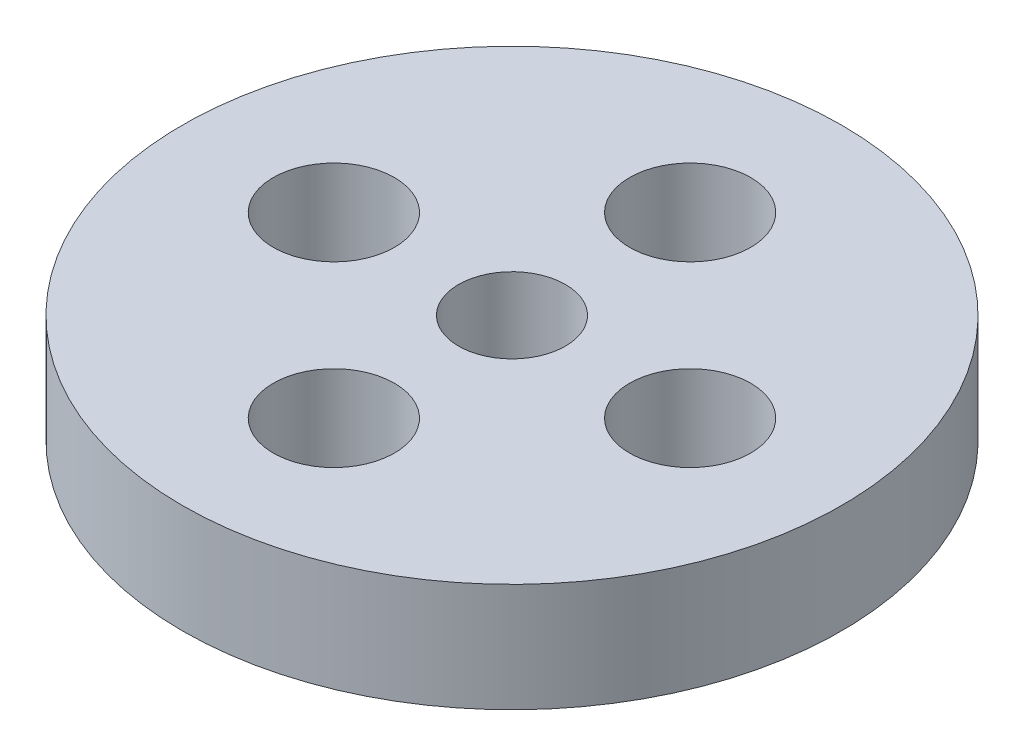
ISO-10303-21;
HEADER;
FILE_DESCRIPTION(('STEP AP214'),'2;1');
FILE_NAME('part.step','',(''),(''),'','','');
FILE_SCHEMA(('AUTOMOTIVE_DESIGN { 1 0 10303 214 1 1 1 1 }'));
ENDSEC;
DATA;
#1=APPLICATION_CONTEXT('core data for automotive mechanical design processes');
#2=APPLICATION_PROTOCOL_DEFINITION('international standard','automotive_design',2000,#1);
#3=PRODUCT_CONTEXT('',#1,'mechanical');
#4=PRODUCT('Part','Part','',(#3));
#5=PRODUCT_RELATED_PRODUCT_CATEGORY('part','',(#4));
#6=PRODUCT_DEFINITION_FORMATION('','',#4);
#7=PRODUCT_DEFINITION_CONTEXT('part definition',#1,'design');
#8=PRODUCT_DEFINITION('design','',#6,#7);
#9=PRODUCT_DEFINITION_SHAPE('','',#8);
#10=(LENGTH_UNIT() NAMED_UNIT(*) SI_UNIT(.MILLI.,.METRE.));
#11=(NAMED_UNIT(*) PLANE_ANGLE_UNIT() SI_UNIT($,.RADIAN.));
#12=(NAMED_UNIT(*) SI_UNIT($,.STERADIAN.) SOLID_ANGLE_UNIT());
#13=UNCERTAINTY_MEASURE_WITH_UNIT(LENGTH_MEASURE(1.E-05),#10,'distance_accuracy_value','');
#14=(GEOMETRIC_REPRESENTATION_CONTEXT(3) GLOBAL_UNCERTAINTY_ASSIGNED_CONTEXT((#13)) GLOBAL_UNIT_ASSIGNED_CONTEXT((#10,
#11,#12)) REPRESENTATION_CONTEXT('',''));
#15=CARTESIAN_POINT('',(0.,0.,0.));
#16=DIRECTION('',(0.,0.,1.));
#17=DIRECTION('',(1.,0.,0.));
#18=AXIS2_PLACEMENT_3D('',#15,#16,#17);
#19=CARTESIAN_POINT('',(0.,3.048,0.));
#20=DIRECTION('',(0.,1.,0.));
#21=DIRECTION('',(0.,0.,1.));
#22=AXIS2_PLACEMENT_3D('',#19,#20,#21);
#23=PLANE('',#22);
#24=CARTESIAN_POINT('',(5.,3.048,0.));
#25=DIRECTION('',(0.,1.,0.));
#26=DIRECTION('',(0.,0.,1.));
#27=AXIS2_PLACEMENT_3D('',#24,#25,#26);
#28=CIRCLE('',#27,1.7);
#29=CARTESIAN_POINT('',(5.,3.048,-1.7));
#30=VERTEX_POINT('',#29);
#31=EDGE_CURVE('E78',#30,#30,#28,.T.);
#32=ORIENTED_EDGE('',*,*,#31,.F.);
#33=EDGE_LOOP('',(#32));
#34=FACE_BOUND('',#33,.T.);
#35=CARTESIAN_POINT('',(-5.,3.048,0.));
#36=DIRECTION('',(0.,1.,0.));
#37=DIRECTION('',(0.,0.,1.));
#38=AXIS2_PLACEMENT_3D('',#35,#36,#37);
#39=CIRCLE('',#38,1.7);
#40=CARTESIAN_POINT('',(-5.,3.048,-1.7));
#41=VERTEX_POINT('',#40);
#42=EDGE_CURVE('E62',#41,#41,#39,.T.);
#43=ORIENTED_EDGE('',*,*,#42,.F.);
#44=EDGE_LOOP('',(#43));
#45=FACE_BOUND('',#44,.T.);
#46=CARTESIAN_POINT('',(0.,3.048,0.));
#47=DIRECTION('',(0.,1.,0.));
#48=DIRECTION('',(0.,0.,1.));
#49=AXIS2_PLACEMENT_3D('',#46,#47,#48);
#50=CIRCLE('',#49,9.25);
#51=CARTESIAN_POINT('',(0.,3.048,-9.25));
#52=VERTEX_POINT('',#51);
#53=EDGE_CURVE('E10',#52,#52,#50,.T.);
#54=ORIENTED_EDGE('',*,*,#53,.T.);
#55=EDGE_LOOP('',(#54));
#56=FACE_BOUND('',#55,.T.);
#57=CARTESIAN_POINT('',(0.,3.048,-5.));
#58=DIRECTION('',(0.,1.,0.));
#59=DIRECTION('',(0.,0.,1.));
#60=AXIS2_PLACEMENT_3D('',#57,#58,#59);
#61=CIRCLE('',#60,1.7);
#62=CARTESIAN_POINT('',(0.,3.048,-6.7));
#63=VERTEX_POINT('',#62);
#64=EDGE_CURVE('E56',#63,#63,#61,.T.);
#65=ORIENTED_EDGE('',*,*,#64,.F.);
#66=EDGE_LOOP('',(#65));
#67=FACE_BOUND('',#66,.T.);
#68=CARTESIAN_POINT('',(0.,3.048,5.));
#69=DIRECTION('',(0.,1.,0.));
#70=DIRECTION('',(0.,0.,1.));
#71=AXIS2_PLACEMENT_3D('',#68,#69,#70);
#72=CIRCLE('',#71,1.7);
#73=CARTESIAN_POINT('',(0.,3.048,3.3));
#74=VERTEX_POINT('',#73);
#75=EDGE_CURVE('E70',#74,#74,#72,.T.);
#76=ORIENTED_EDGE('',*,*,#75,.F.);
#77=EDGE_LOOP('',(#76));
#78=FACE_BOUND('',#77,.T.);
#79=CARTESIAN_POINT('',(0.,3.048,0.));
#80=DIRECTION('',(0.,1.,0.));
#81=DIRECTION('',(0.,0.,1.));
#82=AXIS2_PLACEMENT_3D('',#79,#80,#81);
#83=CIRCLE('',#82,1.5);
#84=CARTESIAN_POINT('',(0.,3.048,-1.5));
#85=VERTEX_POINT('',#84);
#86=EDGE_CURVE('E86',#85,#85,#83,.T.);
#87=ORIENTED_EDGE('',*,*,#86,.F.);
#88=EDGE_LOOP('',(#87));
#89=FACE_BOUND('',#88,.T.);
#90=ADVANCED_FACE('F43',(#34,#45,#56,#67,#78,#89),#23,.T.);
#91=CARTESIAN_POINT('',(0.,0.,0.));
#92=DIRECTION('',(0.,1.,0.));
#93=DIRECTION('',(0.,0.,1.));
#94=AXIS2_PLACEMENT_3D('',#91,#92,#93);
#95=PLANE('',#94);
#96=CARTESIAN_POINT('',(0.,0.,0.));
#97=DIRECTION('',(0.,1.,0.));
#98=DIRECTION('',(0.,0.,1.));
#99=AXIS2_PLACEMENT_3D('',#96,#97,#98);
#100=CIRCLE('',#99,9.25);
#101=CARTESIAN_POINT('',(0.,0.,-9.25));
#102=VERTEX_POINT('',#101);
#103=EDGE_CURVE('E47',#102,#102,#100,.T.);
#104=ORIENTED_EDGE('',*,*,#103,.F.);
#105=EDGE_LOOP('',(#104));
#106=FACE_BOUND('',#105,.T.);
#107=CARTESIAN_POINT('',(0.,0.,-5.));
#108=DIRECTION('',(0.,1.,0.));
#109=DIRECTION('',(0.,0.,1.));
#110=AXIS2_PLACEMENT_3D('',#107,#108,#109);
#111=CIRCLE('',#110,1.7);
#112=CARTESIAN_POINT('',(0.,0.,-6.7));
#113=VERTEX_POINT('',#112);
#114=EDGE_CURVE('E58',#113,#113,#111,.T.);
#115=ORIENTED_EDGE('',*,*,#114,.T.);
#116=EDGE_LOOP('',(#115));
#117=FACE_BOUND('',#116,.T.);
#118=CARTESIAN_POINT('',(-5.,0.,0.));
#119=DIRECTION('',(0.,1.,0.));
#120=DIRECTION('',(0.,0.,1.));
#121=AXIS2_PLACEMENT_3D('',#118,#119,#120);
#122=CIRCLE('',#121,1.7);
#123=CARTESIAN_POINT('',(-5.,0.,-1.7));
#124=VERTEX_POINT('',#123);
#125=EDGE_CURVE('E66',#124,#124,#122,.T.);
#126=ORIENTED_EDGE('',*,*,#125,.T.);
#127=EDGE_LOOP('',(#126));
#128=FACE_BOUND('',#127,.T.);
#129=CARTESIAN_POINT('',(0.,0.,5.));
#130=DIRECTION('',(0.,1.,0.));
#131=DIRECTION('',(0.,0.,1.));
#132=AXIS2_PLACEMENT_3D('',#129,#130,#131);
#133=CIRCLE('',#132,1.7);
#134=CARTESIAN_POINT('',(0.,0.,3.3));
#135=VERTEX_POINT('',#134);
#136=EDGE_CURVE('E74',#135,#135,#133,.T.);
#137=ORIENTED_EDGE('',*,*,#136,.T.);
#138=EDGE_LOOP('',(#137));
#139=FACE_BOUND('',#138,.T.);
#140=CARTESIAN_POINT('',(5.,0.,0.));
#141=DIRECTION('',(0.,1.,0.));
#142=DIRECTION('',(0.,0.,1.));
#143=AXIS2_PLACEMENT_3D('',#140,#141,#142);
#144=CIRCLE('',#143,1.7);
#145=CARTESIAN_POINT('',(5.,0.,-1.7));
#146=VERTEX_POINT('',#145);
#147=EDGE_CURVE('E82',#146,#146,#144,.T.);
#148=ORIENTED_EDGE('',*,*,#147,.T.);
#149=EDGE_LOOP('',(#148));
#150=FACE_BOUND('',#149,.T.);
#151=CARTESIAN_POINT('',(0.,0.,0.));
#152=DIRECTION('',(0.,1.,0.));
#153=DIRECTION('',(0.,0.,1.));
#154=AXIS2_PLACEMENT_3D('',#151,#152,#153);
#155=CIRCLE('',#154,1.5);
#156=CARTESIAN_POINT('',(0.,0.,-1.5));
#157=VERTEX_POINT('',#156);
#158=EDGE_CURVE('E90',#157,#157,#155,.T.);
#159=ORIENTED_EDGE('',*,*,#158,.T.);
#160=EDGE_LOOP('',(#159));
#161=FACE_BOUND('',#160,.T.);
#162=ADVANCED_FACE('F102',(#106,#117,#128,#139,#150,#161),#95,.F.);
#163=CARTESIAN_POINT('',(0.,3.048,0.));
#164=DIRECTION('',(0.,-1.,0.));
#165=DIRECTION('',(0.,0.,-1.));
#166=AXIS2_PLACEMENT_3D('',#163,#164,#165);
#167=CYLINDRICAL_SURFACE('',#166,9.25);
#168=CARTESIAN_POINT('',(0.,3.048,-9.25));
#169=CARTESIAN_POINT('',(0.,3.01625,-9.25));
#170=CARTESIAN_POINT('',(0.,2.9845,-9.25));
#171=CARTESIAN_POINT('',(0.,2.921,-9.25));
#172=CARTESIAN_POINT('',(0.,2.88925,-9.25));
#173=CARTESIAN_POINT('',(0.,2.82575,-9.25));
#174=CARTESIAN_POINT('',(0.,2.794,-9.25));
#175=CARTESIAN_POINT('',(0.,2.7305,-9.25));
#176=CARTESIAN_POINT('',(0.,2.69875,-9.25));
#177=CARTESIAN_POINT('',(0.,2.63525,-9.25));
#178=CARTESIAN_POINT('',(0.,2.6035,-9.25));
#179=CARTESIAN_POINT('',(0.,2.54,-9.25));
#180=CARTESIAN_POINT('',(0.,2.50825,-9.25));
#181=CARTESIAN_POINT('',(0.,2.44475,-9.25));
#182=CARTESIAN_POINT('',(0.,2.413,-9.25));
#183=CARTESIAN_POINT('',(0.,2.3495,-9.25));
#184=CARTESIAN_POINT('',(0.,2.31775,-9.25));
#185=CARTESIAN_POINT('',(0.,2.25425,-9.25));
#186=CARTESIAN_POINT('',(0.,2.2225,-9.25));
#187=CARTESIAN_POINT('',(0.,2.159,-9.25));
#188=CARTESIAN_POINT('',(0.,2.12725,-9.25));
#189=CARTESIAN_POINT('',(0.,2.06375,-9.25));
#190=CARTESIAN_POINT('',(0.,2.032,-9.25));
#191=CARTESIAN_POINT('',(0.,1.9685,-9.25));
#192=CARTESIAN_POINT('',(0.,1.93675,-9.25));
#193=CARTESIAN_POINT('',(0.,1.87325,-9.25));
#194=CARTESIAN_POINT('',(0.,1.8415,-9.25));
#195=CARTESIAN_POINT('',(0.,1.778,-9.25));
#196=CARTESIAN_POINT('',(0.,1.74625,-9.25));
#197=CARTESIAN_POINT('',(0.,1.68275,-9.25));
#198=CARTESIAN_POINT('',(0.,1.651,-9.25));
#199=CARTESIAN_POINT('',(0.,1.5875,-9.25));
#200=CARTESIAN_POINT('',(0.,1.55575,-9.25));
#201=CARTESIAN_POINT('',(0.,1.49225,-9.25));
#202=CARTESIAN_POINT('',(0.,1.4605,-9.25));
#203=CARTESIAN_POINT('',(0.,1.397,-9.25));
#204=CARTESIAN_POINT('',(0.,1.36525,-9.25));
#205=CARTESIAN_POINT('',(0.,1.30175,-9.25));
#206=CARTESIAN_POINT('',(0.,1.27,-9.25));
#207=CARTESIAN_POINT('',(0.,1.2065,-9.25));
#208=CARTESIAN_POINT('',(0.,1.17475,-9.25));
#209=CARTESIAN_POINT('',(0.,1.11125,-9.25));
#210=CARTESIAN_POINT('',(0.,1.0795,-9.25));
#211=CARTESIAN_POINT('',(0.,1.016,-9.25));
#212=CARTESIAN_POINT('',(0.,0.98425,-9.25));
#213=CARTESIAN_POINT('',(0.,0.92075,-9.25));
#214=CARTESIAN_POINT('',(0.,0.889,-9.25));
#215=CARTESIAN_POINT('',(0.,0.8255,-9.25));
#216=CARTESIAN_POINT('',(0.,0.79375,-9.25));
#217=CARTESIAN_POINT('',(0.,0.73025,-9.25));
#218=CARTESIAN_POINT('',(0.,0.6985,-9.25));
#219=CARTESIAN_POINT('',(0.,0.635,-9.25));
#220=CARTESIAN_POINT('',(0.,0.60325,-9.25));
#221=CARTESIAN_POINT('',(0.,0.53975,-9.25));
#222=CARTESIAN_POINT('',(0.,0.508,-9.25));
#223=CARTESIAN_POINT('',(0.,0.4445,-9.25));
#224=CARTESIAN_POINT('',(0.,0.41275,-9.25));
#225=CARTESIAN_POINT('',(0.,0.34925,-9.25));
#226=CARTESIAN_POINT('',(0.,0.3175,-9.25));
#227=CARTESIAN_POINT('',(0.,0.254,-9.25));
#228=CARTESIAN_POINT('',(0.,0.22225,-9.25));
#229=CARTESIAN_POINT('',(0.,0.15875,-9.25));
#230=CARTESIAN_POINT('',(0.,0.127,-9.25));
#231=CARTESIAN_POINT('',(0.,0.0634999999999999,-9.25));
#232=CARTESIAN_POINT('',(0.,0.03175,-9.25));
#233=CARTESIAN_POINT('',(0.,0.,-9.25));
#234=B_SPLINE_CURVE_WITH_KNOTS('',3,(#168,#169,#170,#171,#172,#173,#174,#175,#176,#177,#178,
#179,#180,#181,#182,#183,#184,#185,#186,#187,#188,#189,#190,#191,#192,#193,#194,#195,#196,#197,
#198,#199,#200,#201,#202,#203,#204,#205,#206,#207,#208,#209,#210,#211,#212,#213,#214,#215,#216,
#217,#218,#219,#220,#221,#222,#223,#224,#225,#226,#227,#228,#229,#230,#231,#232,#233),
.UNSPECIFIED.,.F.,.F.,(4,2,2,2,2,2,2,2,2,2,2,2,2,2,2,2,2,2,2,2,2,2,2,2,2,2,2,2,2,2,2,2,4),(0.,
0.0952499999999998,0.1905,0.28575,0.381,0.47625,0.5715,0.66675,0.762,0.85725,0.9525,1.04775,
1.143,1.23825,1.3335,1.42875,1.524,1.61925,1.7145,1.80975,1.905,2.00025,2.0955,2.19075,2.286,
2.38125,2.4765,2.57175,2.667,2.76225,2.8575,2.95275,3.048),.UNSPECIFIED.);
#235=EDGE_CURVE('BSEAM45',#52,#102,#234,.T.);
#236=ORIENTED_EDGE('',*,*,#53,.F.);
#237=ORIENTED_EDGE('',*,*,#103,.T.);
#238=ORIENTED_EDGE('',*,*,#235,.T.);
#239=ORIENTED_EDGE('',*,*,#235,.F.);
#240=EDGE_LOOP('',(#236,#238,#237,#239));
#241=FACE_BOUND('',#240,.T.);
#242=ADVANCED_FACE('F45',(#241),#167,.T.);
#243=CARTESIAN_POINT('',(0.,3.048,-5.));
#244=DIRECTION('',(0.,-1.,0.));
#245=DIRECTION('',(0.,0.,-1.));
#246=AXIS2_PLACEMENT_3D('',#243,#244,#245);
#247=CYLINDRICAL_SURFACE('',#246,1.7);
#248=CARTESIAN_POINT('',(0.,3.048,-6.7));
#249=CARTESIAN_POINT('',(0.,3.01625,-6.7));
#250=CARTESIAN_POINT('',(0.,2.9845,-6.7));
#251=CARTESIAN_POINT('',(0.,2.921,-6.7));
#252=CARTESIAN_POINT('',(0.,2.88925,-6.7));
#253=CARTESIAN_POINT('',(0.,2.82575,-6.7));
#254=CARTESIAN_POINT('',(0.,2.794,-6.7));
#255=CARTESIAN_POINT('',(0.,2.7305,-6.7));
#256=CARTESIAN_POINT('',(0.,2.69875,-6.7));
#257=CARTESIAN_POINT('',(0.,2.63525,-6.7));
#258=CARTESIAN_POINT('',(0.,2.6035,-6.7));
#259=CARTESIAN_POINT('',(0.,2.54,-6.7));
#260=CARTESIAN_POINT('',(0.,2.50825,-6.7));
#261=CARTESIAN_POINT('',(0.,2.44475,-6.7));
#262=CARTESIAN_POINT('',(0.,2.413,-6.7));
#263=CARTESIAN_POINT('',(0.,2.3495,-6.7));
#264=CARTESIAN_POINT('',(0.,2.31775,-6.7));
#265=CARTESIAN_POINT('',(0.,2.25425,-6.7));
#266=CARTESIAN_POINT('',(0.,2.2225,-6.7));
#267=CARTESIAN_POINT('',(0.,2.159,-6.7));
#268=CARTESIAN_POINT('',(0.,2.12725,-6.7));
#269=CARTESIAN_POINT('',(0.,2.06375,-6.7));
#270=CARTESIAN_POINT('',(0.,2.032,-6.7));
#271=CARTESIAN_POINT('',(0.,1.9685,-6.7));
#272=CARTESIAN_POINT('',(0.,1.93675,-6.7));
#273=CARTESIAN_POINT('',(0.,1.87325,-6.7));
#274=CARTESIAN_POINT('',(0.,1.8415,-6.7));
#275=CARTESIAN_POINT('',(0.,1.778,-6.7));
#276=CARTESIAN_POINT('',(0.,1.74625,-6.7));
#277=CARTESIAN_POINT('',(0.,1.68275,-6.7));
#278=CARTESIAN_POINT('',(0.,1.651,-6.7));
#279=CARTESIAN_POINT('',(0.,1.5875,-6.7));
#280=CARTESIAN_POINT('',(0.,1.55575,-6.7));
#281=CARTESIAN_POINT('',(0.,1.49225,-6.7));
#282=CARTESIAN_POINT('',(0.,1.4605,-6.7));
#283=CARTESIAN_POINT('',(0.,1.397,-6.7));
#284=CARTESIAN_POINT('',(0.,1.36525,-6.7));
#285=CARTESIAN_POINT('',(0.,1.30175,-6.7));
#286=CARTESIAN_POINT('',(0.,1.27,-6.7));
#287=CARTESIAN_POINT('',(0.,1.2065,-6.7));
#288=CARTESIAN_POINT('',(0.,1.17475,-6.7));
#289=CARTESIAN_POINT('',(0.,1.11125,-6.7));
#290=CARTESIAN_POINT('',(0.,1.0795,-6.7));
#291=CARTESIAN_POINT('',(0.,1.016,-6.7));
#292=CARTESIAN_POINT('',(0.,0.98425,-6.7));
#293=CARTESIAN_POINT('',(0.,0.92075,-6.7));
#294=CARTESIAN_POINT('',(0.,0.889,-6.7));
#295=CARTESIAN_POINT('',(0.,0.8255,-6.7));
#296=CARTESIAN_POINT('',(0.,0.79375,-6.7));
#297=CARTESIAN_POINT('',(0.,0.73025,-6.7));
#298=CARTESIAN_POINT('',(0.,0.6985,-6.7));
#299=CARTESIAN_POINT('',(0.,0.635,-6.7));
#300=CARTESIAN_POINT('',(0.,0.60325,-6.7));
#301=CARTESIAN_POINT('',(0.,0.53975,-6.7));
#302=CARTESIAN_POINT('',(0.,0.508,-6.7));
#303=CARTESIAN_POINT('',(0.,0.4445,-6.7));
#304=CARTESIAN_POINT('',(0.,0.41275,-6.7));
#305=CARTESIAN_POINT('',(0.,0.34925,-6.7));
#306=CARTESIAN_POINT('',(0.,0.3175,-6.7));
#307=CARTESIAN_POINT('',(0.,0.254,-6.7));
#308=CARTESIAN_POINT('',(0.,0.22225,-6.7));
#309=CARTESIAN_POINT('',(0.,0.15875,-6.7));
#310=CARTESIAN_POINT('',(0.,0.127,-6.7));
#311=CARTESIAN_POINT('',(0.,0.0634999999999999,-6.7));
#312=CARTESIAN_POINT('',(0.,0.03175,-6.7));
#313=CARTESIAN_POINT('',(0.,0.,-6.7));
#314=B_SPLINE_CURVE_WITH_KNOTS('',3,(#248,#249,#250,#251,#252,#253,#254,#255,#256,#257,#258,
#259,#260,#261,#262,#263,#264,#265,#266,#267,#268,#269,#270,#271,#272,#273,#274,#275,#276,#277,
#278,#279,#280,#281,#282,#283,#284,#285,#286,#287,#288,#289,#290,#291,#292,#293,#294,#295,#296,
#297,#298,#299,#300,#301,#302,#303,#304,#305,#306,#307,#308,#309,#310,#311,#312,#313),
.UNSPECIFIED.,.F.,.F.,(4,2,2,2,2,2,2,2,2,2,2,2,2,2,2,2,2,2,2,2,2,2,2,2,2,2,2,2,2,2,2,2,4),(0.,
0.0952499999999998,0.1905,0.28575,0.381,0.47625,0.5715,0.66675,0.762,0.85725,0.9525,1.04775,
1.143,1.23825,1.3335,1.42875,1.524,1.61925,1.7145,1.80975,1.905,2.00025,2.0955,2.19075,2.286,
2.38125,2.4765,2.57175,2.667,2.76225,2.8575,2.95275,3.048),.UNSPECIFIED.);
#315=EDGE_CURVE('BSEAM112',#63,#113,#314,.T.);
#316=ORIENTED_EDGE('',*,*,#64,.T.);
#317=ORIENTED_EDGE('',*,*,#114,.F.);
#318=ORIENTED_EDGE('',*,*,#315,.T.);
#319=ORIENTED_EDGE('',*,*,#315,.F.);
#320=EDGE_LOOP('',(#316,#318,#317,#319));
#321=FACE_BOUND('',#320,.T.);
#322=ADVANCED_FACE('F112',(#321),#247,.F.);
#323=CARTESIAN_POINT('',(-5.,3.048,0.));
#324=DIRECTION('',(0.,-1.,0.));
#325=DIRECTION('',(0.,0.,-1.));
#326=AXIS2_PLACEMENT_3D('',#323,#324,#325);
#327=CYLINDRICAL_SURFACE('',#326,1.7);
#328=CARTESIAN_POINT('',(-5.,3.048,-1.7));
#329=CARTESIAN_POINT('',(-5.,3.01625,-1.7));
#330=CARTESIAN_POINT('',(-5.,2.9845,-1.7));
#331=CARTESIAN_POINT('',(-5.,2.921,-1.7));
#332=CARTESIAN_POINT('',(-5.,2.88925,-1.7));
#333=CARTESIAN_POINT('',(-5.,2.82575,-1.7));
#334=CARTESIAN_POINT('',(-5.,2.794,-1.7));
#335=CARTESIAN_POINT('',(-5.,2.7305,-1.7));
#336=CARTESIAN_POINT('',(-5.,2.69875,-1.7));
#337=CARTESIAN_POINT('',(-5.,2.63525,-1.7));
#338=CARTESIAN_POINT('',(-5.,2.6035,-1.7));
#339=CARTESIAN_POINT('',(-5.,2.54,-1.7));
#340=CARTESIAN_POINT('',(-5.,2.50825,-1.7));
#341=CARTESIAN_POINT('',(-5.,2.44475,-1.7));
#342=CARTESIAN_POINT('',(-5.,2.413,-1.7));
#343=CARTESIAN_POINT('',(-5.,2.3495,-1.7));
#344=CARTESIAN_POINT('',(-5.,2.31775,-1.7));
#345=CARTESIAN_POINT('',(-5.,2.25425,-1.7));
#346=CARTESIAN_POINT('',(-5.,2.2225,-1.7));
#347=CARTESIAN_POINT('',(-5.,2.159,-1.7));
#348=CARTESIAN_POINT('',(-5.,2.12725,-1.7));
#349=CARTESIAN_POINT('',(-5.,2.06375,-1.7));
#350=CARTESIAN_POINT('',(-5.,2.032,-1.7));
#351=CARTESIAN_POINT('',(-5.,1.9685,-1.7));
#352=CARTESIAN_POINT('',(-5.,1.93675,-1.7));
#353=CARTESIAN_POINT('',(-5.,1.87325,-1.7));
#354=CARTESIAN_POINT('',(-5.,1.8415,-1.7));
#355=CARTESIAN_POINT('',(-5.,1.778,-1.7));
#356=CARTESIAN_POINT('',(-5.,1.74625,-1.7));
#357=CARTESIAN_POINT('',(-5.,1.68275,-1.7));
#358=CARTESIAN_POINT('',(-5.,1.651,-1.7));
#359=CARTESIAN_POINT('',(-5.,1.5875,-1.7));
#360=CARTESIAN_POINT('',(-5.,1.55575,-1.7));
#361=CARTESIAN_POINT('',(-5.,1.49225,-1.7));
#362=CARTESIAN_POINT('',(-5.,1.4605,-1.7));
#363=CARTESIAN_POINT('',(-5.,1.397,-1.7));
#364=CARTESIAN_POINT('',(-5.,1.36525,-1.7));
#365=CARTESIAN_POINT('',(-5.,1.30175,-1.7));
#366=CARTESIAN_POINT('',(-5.,1.27,-1.7));
#367=CARTESIAN_POINT('',(-5.,1.2065,-1.7));
#368=CARTESIAN_POINT('',(-5.,1.17475,-1.7));
#369=CARTESIAN_POINT('',(-5.,1.11125,-1.7));
#370=CARTESIAN_POINT('',(-5.,1.0795,-1.7));
#371=CARTESIAN_POINT('',(-5.,1.016,-1.7));
#372=CARTESIAN_POINT('',(-5.,0.98425,-1.7));
#373=CARTESIAN_POINT('',(-5.,0.92075,-1.7));
#374=CARTESIAN_POINT('',(-5.,0.889,-1.7));
#375=CARTESIAN_POINT('',(-5.,0.8255,-1.7));
#376=CARTESIAN_POINT('',(-5.,0.79375,-1.7));
#377=CARTESIAN_POINT('',(-5.,0.73025,-1.7));
#378=CARTESIAN_POINT('',(-5.,0.6985,-1.7));
#379=CARTESIAN_POINT('',(-5.,0.635,-1.7));
#380=CARTESIAN_POINT('',(-5.,0.60325,-1.7));
#381=CARTESIAN_POINT('',(-5.,0.53975,-1.7));
#382=CARTESIAN_POINT('',(-5.,0.508,-1.7));
#383=CARTESIAN_POINT('',(-5.,0.4445,-1.7));
#384=CARTESIAN_POINT('',(-5.,0.41275,-1.7));
#385=CARTESIAN_POINT('',(-5.,0.34925,-1.7));
#386=CARTESIAN_POINT('',(-5.,0.3175,-1.7));
#387=CARTESIAN_POINT('',(-5.,0.254,-1.7));
#388=CARTESIAN_POINT('',(-5.,0.22225,-1.7));
#389=CARTESIAN_POINT('',(-5.,0.15875,-1.7));
#390=CARTESIAN_POINT('',(-5.,0.127,-1.7));
#391=CARTESIAN_POINT('',(-5.,0.0634999999999999,-1.7));
#392=CARTESIAN_POINT('',(-5.,0.03175,-1.7));
#393=CARTESIAN_POINT('',(-5.,0.,-1.7));
#394=B_SPLINE_CURVE_WITH_KNOTS('',3,(#328,#329,#330,#331,#332,#333,#334,#335,#336,#337,#338,
#339,#340,#341,#342,#343,#344,#345,#346,#347,#348,#349,#350,#351,#352,#353,#354,#355,#356,#357,
#358,#359,#360,#361,#362,#363,#364,#365,#366,#367,#368,#369,#370,#371,#372,#373,#374,#375,#376,
#377,#378,#379,#380,#381,#382,#383,#384,#385,#386,#387,#388,#389,#390,#391,#392,#393),
.UNSPECIFIED.,.F.,.F.,(4,2,2,2,2,2,2,2,2,2,2,2,2,2,2,2,2,2,2,2,2,2,2,2,2,2,2,2,2,2,2,2,4),(0.,
0.0952499999999998,0.1905,0.28575,0.381,0.47625,0.5715,0.66675,0.762,0.85725,0.9525,1.04775,
1.143,1.23825,1.3335,1.42875,1.524,1.61925,1.7145,1.80975,1.905,2.00025,2.0955,2.19075,2.286,
2.38125,2.4765,2.57175,2.667,2.76225,2.8575,2.95275,3.048),.UNSPECIFIED.);
#395=EDGE_CURVE('BSEAM115',#41,#124,#394,.T.);
#396=ORIENTED_EDGE('',*,*,#42,.T.);
#397=ORIENTED_EDGE('',*,*,#125,.F.);
#398=ORIENTED_EDGE('',*,*,#395,.T.);
#399=ORIENTED_EDGE('',*,*,#395,.F.);
#400=EDGE_LOOP('',(#396,#398,#397,#399));
#401=FACE_BOUND('',#400,.T.);
#402=ADVANCED_FACE('F115',(#401),#327,.F.);
#403=CARTESIAN_POINT('',(0.,3.048,5.));
#404=DIRECTION('',(0.,-1.,0.));
#405=DIRECTION('',(0.,0.,-1.));
#406=AXIS2_PLACEMENT_3D('',#403,#404,#405);
#407=CYLINDRICAL_SURFACE('',#406,1.7);
#408=CARTESIAN_POINT('',(0.,3.048,3.3));
#409=CARTESIAN_POINT('',(0.,3.01625,3.3));
#410=CARTESIAN_POINT('',(0.,2.9845,3.3));
#411=CARTESIAN_POINT('',(0.,2.921,3.3));
#412=CARTESIAN_POINT('',(0.,2.88925,3.3));
#413=CARTESIAN_POINT('',(0.,2.82575,3.3));
#414=CARTESIAN_POINT('',(0.,2.794,3.3));
#415=CARTESIAN_POINT('',(0.,2.7305,3.3));
#416=CARTESIAN_POINT('',(0.,2.69875,3.3));
#417=CARTESIAN_POINT('',(0.,2.63525,3.3));
#418=CARTESIAN_POINT('',(0.,2.6035,3.3));
#419=CARTESIAN_POINT('',(0.,2.54,3.3));
#420=CARTESIAN_POINT('',(0.,2.50825,3.3));
#421=CARTESIAN_POINT('',(0.,2.44475,3.3));
#422=CARTESIAN_POINT('',(0.,2.413,3.3));
#423=CARTESIAN_POINT('',(0.,2.3495,3.3));
#424=CARTESIAN_POINT('',(0.,2.31775,3.3));
#425=CARTESIAN_POINT('',(0.,2.25425,3.3));
#426=CARTESIAN_POINT('',(0.,2.2225,3.3));
#427=CARTESIAN_POINT('',(0.,2.159,3.3));
#428=CARTESIAN_POINT('',(0.,2.12725,3.3));
#429=CARTESIAN_POINT('',(0.,2.06375,3.3));
#430=CARTESIAN_POINT('',(0.,2.032,3.3));
#431=CARTESIAN_POINT('',(0.,1.9685,3.3));
#432=CARTESIAN_POINT('',(0.,1.93675,3.3));
#433=CARTESIAN_POINT('',(0.,1.87325,3.3));
#434=CARTESIAN_POINT('',(0.,1.8415,3.3));
#435=CARTESIAN_POINT('',(0.,1.778,3.3));
#436=CARTESIAN_POINT('',(0.,1.74625,3.3));
#437=CARTESIAN_POINT('',(0.,1.68275,3.3));
#438=CARTESIAN_POINT('',(0.,1.651,3.3));
#439=CARTESIAN_POINT('',(0.,1.5875,3.3));
#440=CARTESIAN_POINT('',(0.,1.55575,3.3));
#441=CARTESIAN_POINT('',(0.,1.49225,3.3));
#442=CARTESIAN_POINT('',(0.,1.4605,3.3));
#443=CARTESIAN_POINT('',(0.,1.397,3.3));
#444=CARTESIAN_POINT('',(0.,1.36525,3.3));
#445=CARTESIAN_POINT('',(0.,1.30175,3.3));
#446=CARTESIAN_POINT('',(0.,1.27,3.3));
#447=CARTESIAN_POINT('',(0.,1.2065,3.3));
#448=CARTESIAN_POINT('',(0.,1.17475,3.3));
#449=CARTESIAN_POINT('',(0.,1.11125,3.3));
#450=CARTESIAN_POINT('',(0.,1.0795,3.3));
#451=CARTESIAN_POINT('',(0.,1.016,3.3));
#452=CARTESIAN_POINT('',(0.,0.98425,3.3));
#453=CARTESIAN_POINT('',(0.,0.92075,3.3));
#454=CARTESIAN_POINT('',(0.,0.889,3.3));
#455=CARTESIAN_POINT('',(0.,0.8255,3.3));
#456=CARTESIAN_POINT('',(0.,0.79375,3.3));
#457=CARTESIAN_POINT('',(0.,0.73025,3.3));
#458=CARTESIAN_POINT('',(0.,0.6985,3.3));
#459=CARTESIAN_POINT('',(0.,0.635,3.3));
#460=CARTESIAN_POINT('',(0.,0.60325,3.3));
#461=CARTESIAN_POINT('',(0.,0.53975,3.3));
#462=CARTESIAN_POINT('',(0.,0.508,3.3));
#463=CARTESIAN_POINT('',(0.,0.4445,3.3));
#464=CARTESIAN_POINT('',(0.,0.41275,3.3));
#465=CARTESIAN_POINT('',(0.,0.34925,3.3));
#466=CARTESIAN_POINT('',(0.,0.3175,3.3));
#467=CARTESIAN_POINT('',(0.,0.254,3.3));
#468=CARTESIAN_POINT('',(0.,0.22225,3.3));
#469=CARTESIAN_POINT('',(0.,0.15875,3.3));
#470=CARTESIAN_POINT('',(0.,0.127,3.3));
#471=CARTESIAN_POINT('',(0.,0.0634999999999999,3.3));
#472=CARTESIAN_POINT('',(0.,0.03175,3.3));
#473=CARTESIAN_POINT('',(0.,0.,3.3));
#474=B_SPLINE_CURVE_WITH_KNOTS('',3,(#408,#409,#410,#411,#412,#413,#414,#415,#416,#417,#418,
#419,#420,#421,#422,#423,#424,#425,#426,#427,#428,#429,#430,#431,#432,#433,#434,#435,#436,#437,
#438,#439,#440,#441,#442,#443,#444,#445,#446,#447,#448,#449,#450,#451,#452,#453,#454,#455,#456,
#457,#458,#459,#460,#461,#462,#463,#464,#465,#466,#467,#468,#469,#470,#471,#472,#473),
.UNSPECIFIED.,.F.,.F.,(4,2,2,2,2,2,2,2,2,2,2,2,2,2,2,2,2,2,2,2,2,2,2,2,2,2,2,2,2,2,2,2,4),(0.,
0.0952499999999998,0.1905,0.28575,0.381,0.47625,0.5715,0.66675,0.762,0.85725,0.9525,1.04775,
1.143,1.23825,1.3335,1.42875,1.524,1.61925,1.7145,1.80975,1.905,2.00025,2.0955,2.19075,2.286,
2.38125,2.4765,2.57175,2.667,2.76225,2.8575,2.95275,3.048),.UNSPECIFIED.);
#475=EDGE_CURVE('BSEAM119',#74,#135,#474,.T.);
#476=ORIENTED_EDGE('',*,*,#75,.T.);
#477=ORIENTED_EDGE('',*,*,#136,.F.);
#478=ORIENTED_EDGE('',*,*,#475,.T.);
#479=ORIENTED_EDGE('',*,*,#475,.F.);
#480=EDGE_LOOP('',(#476,#478,#477,#479));
#481=FACE_BOUND('',#480,.T.);
#482=ADVANCED_FACE('F119',(#481),#407,.F.);
#483=CARTESIAN_POINT('',(5.,3.048,0.));
#484=DIRECTION('',(0.,-1.,0.));
#485=DIRECTION('',(0.,0.,-1.));
#486=AXIS2_PLACEMENT_3D('',#483,#484,#485);
#487=CYLINDRICAL_SURFACE('',#486,1.7);
#488=CARTESIAN_POINT('',(5.,3.048,-1.7));
#489=CARTESIAN_POINT('',(5.,3.01625,-1.7));
#490=CARTESIAN_POINT('',(5.,2.9845,-1.7));
#491=CARTESIAN_POINT('',(5.,2.921,-1.7));
#492=CARTESIAN_POINT('',(5.,2.88925,-1.7));
#493=CARTESIAN_POINT('',(5.,2.82575,-1.7));
#494=CARTESIAN_POINT('',(5.,2.794,-1.7));
#495=CARTESIAN_POINT('',(5.,2.7305,-1.7));
#496=CARTESIAN_POINT('',(5.,2.69875,-1.7));
#497=CARTESIAN_POINT('',(5.,2.63525,-1.7));
#498=CARTESIAN_POINT('',(5.,2.6035,-1.7));
#499=CARTESIAN_POINT('',(5.,2.54,-1.7));
#500=CARTESIAN_POINT('',(5.,2.50825,-1.7));
#501=CARTESIAN_POINT('',(5.,2.44475,-1.7));
#502=CARTESIAN_POINT('',(5.,2.413,-1.7));
#503=CARTESIAN_POINT('',(5.,2.3495,-1.7));
#504=CARTESIAN_POINT('',(5.,2.31775,-1.7));
#505=CARTESIAN_POINT('',(5.,2.25425,-1.7));
#506=CARTESIAN_POINT('',(5.,2.2225,-1.7));
#507=CARTESIAN_POINT('',(5.,2.159,-1.7));
#508=CARTESIAN_POINT('',(5.,2.12725,-1.7));
#509=CARTESIAN_POINT('',(5.,2.06375,-1.7));
#510=CARTESIAN_POINT('',(5.,2.032,-1.7));
#511=CARTESIAN_POINT('',(5.,1.9685,-1.7));
#512=CARTESIAN_POINT('',(5.,1.93675,-1.7));
#513=CARTESIAN_POINT('',(5.,1.87325,-1.7));
#514=CARTESIAN_POINT('',(5.,1.8415,-1.7));
#515=CARTESIAN_POINT('',(5.,1.778,-1.7));
#516=CARTESIAN_POINT('',(5.,1.74625,-1.7));
#517=CARTESIAN_POINT('',(5.,1.68275,-1.7));
#518=CARTESIAN_POINT('',(5.,1.651,-1.7));
#519=CARTESIAN_POINT('',(5.,1.5875,-1.7));
#520=CARTESIAN_POINT('',(5.,1.55575,-1.7));
#521=CARTESIAN_POINT('',(5.,1.49225,-1.7));
#522=CARTESIAN_POINT('',(5.,1.4605,-1.7));
#523=CARTESIAN_POINT('',(5.,1.397,-1.7));
#524=CARTESIAN_POINT('',(5.,1.36525,-1.7));
#525=CARTESIAN_POINT('',(5.,1.30175,-1.7));
#526=CARTESIAN_POINT('',(5.,1.27,-1.7));
#527=CARTESIAN_POINT('',(5.,1.2065,-1.7));
#528=CARTESIAN_POINT('',(5.,1.17475,-1.7));
#529=CARTESIAN_POINT('',(5.,1.11125,-1.7));
#530=CARTESIAN_POINT('',(5.,1.0795,-1.7));
#531=CARTESIAN_POINT('',(5.,1.016,-1.7));
#532=CARTESIAN_POINT('',(5.,0.98425,-1.7));
#533=CARTESIAN_POINT('',(5.,0.92075,-1.7));
#534=CARTESIAN_POINT('',(5.,0.889,-1.7));
#535=CARTESIAN_POINT('',(5.,0.8255,-1.7));
#536=CARTESIAN_POINT('',(5.,0.79375,-1.7));
#537=CARTESIAN_POINT('',(5.,0.73025,-1.7));
#538=CARTESIAN_POINT('',(5.,0.6985,-1.7));
#539=CARTESIAN_POINT('',(5.,0.635,-1.7));
#540=CARTESIAN_POINT('',(5.,0.60325,-1.7));
#541=CARTESIAN_POINT('',(5.,0.53975,-1.7));
#542=CARTESIAN_POINT('',(5.,0.508,-1.7));
#543=CARTESIAN_POINT('',(5.,0.4445,-1.7));
#544=CARTESIAN_POINT('',(5.,0.41275,-1.7));
#545=CARTESIAN_POINT('',(5.,0.34925,-1.7));
#546=CARTESIAN_POINT('',(5.,0.3175,-1.7));
#547=CARTESIAN_POINT('',(5.,0.254,-1.7));
#548=CARTESIAN_POINT('',(5.,0.22225,-1.7));
#549=CARTESIAN_POINT('',(5.,0.15875,-1.7));
#550=CARTESIAN_POINT('',(5.,0.127,-1.7));
#551=CARTESIAN_POINT('',(5.,0.0634999999999999,-1.7));
#552=CARTESIAN_POINT('',(5.,0.03175,-1.7));
#553=CARTESIAN_POINT('',(5.,0.,-1.7));
#554=B_SPLINE_CURVE_WITH_KNOTS('',3,(#488,#489,#490,#491,#492,#493,#494,#495,#496,#497,#498,
#499,#500,#501,#502,#503,#504,#505,#506,#507,#508,#509,#510,#511,#512,#513,#514,#515,#516,#517,
#518,#519,#520,#521,#522,#523,#524,#525,#526,#527,#528,#529,#530,#531,#532,#533,#534,#535,#536,
#537,#538,#539,#540,#541,#542,#543,#544,#545,#546,#547,#548,#549,#550,#551,#552,#553),
.UNSPECIFIED.,.F.,.F.,(4,2,2,2,2,2,2,2,2,2,2,2,2,2,2,2,2,2,2,2,2,2,2,2,2,2,2,2,2,2,2,2,4),(0.,
0.0952499999999998,0.1905,0.28575,0.381,0.47625,0.5715,0.66675,0.762,0.85725,0.9525,1.04775,
1.143,1.23825,1.3335,1.42875,1.524,1.61925,1.7145,1.80975,1.905,2.00025,2.0955,2.19075,2.286,
2.38125,2.4765,2.57175,2.667,2.76225,2.8575,2.95275,3.048),.UNSPECIFIED.);
#555=EDGE_CURVE('BSEAM123',#30,#146,#554,.T.);
#556=ORIENTED_EDGE('',*,*,#31,.T.);
#557=ORIENTED_EDGE('',*,*,#147,.F.);
#558=ORIENTED_EDGE('',*,*,#555,.T.);
#559=ORIENTED_EDGE('',*,*,#555,.F.);
#560=EDGE_LOOP('',(#556,#558,#557,#559));
#561=FACE_BOUND('',#560,.T.);
#562=ADVANCED_FACE('F123',(#561),#487,.F.);
#563=CARTESIAN_POINT('',(0.,3.048,0.));
#564=DIRECTION('',(0.,-1.,0.));
#565=DIRECTION('',(0.,0.,-1.));
#566=AXIS2_PLACEMENT_3D('',#563,#564,#565);
#567=CYLINDRICAL_SURFACE('',#566,1.5);
#568=CARTESIAN_POINT('',(0.,3.048,-1.5));
#569=CARTESIAN_POINT('',(0.,3.01625,-1.5));
#570=CARTESIAN_POINT('',(0.,2.9845,-1.5));
#571=CARTESIAN_POINT('',(0.,2.921,-1.5));
#572=CARTESIAN_POINT('',(0.,2.88925,-1.5));
#573=CARTESIAN_POINT('',(0.,2.82575,-1.5));
#574=CARTESIAN_POINT('',(0.,2.794,-1.5));
#575=CARTESIAN_POINT('',(0.,2.7305,-1.5));
#576=CARTESIAN_POINT('',(0.,2.69875,-1.5));
#577=CARTESIAN_POINT('',(0.,2.63525,-1.5));
#578=CARTESIAN_POINT('',(0.,2.6035,-1.5));
#579=CARTESIAN_POINT('',(0.,2.54,-1.5));
#580=CARTESIAN_POINT('',(0.,2.50825,-1.5));
#581=CARTESIAN_POINT('',(0.,2.44475,-1.5));
#582=CARTESIAN_POINT('',(0.,2.413,-1.5));
#583=CARTESIAN_POINT('',(0.,2.3495,-1.5));
#584=CARTESIAN_POINT('',(0.,2.31775,-1.5));
#585=CARTESIAN_POINT('',(0.,2.25425,-1.5));
#586=CARTESIAN_POINT('',(0.,2.2225,-1.5));
#587=CARTESIAN_POINT('',(0.,2.159,-1.5));
#588=CARTESIAN_POINT('',(0.,2.12725,-1.5));
#589=CARTESIAN_POINT('',(0.,2.06375,-1.5));
#590=CARTESIAN_POINT('',(0.,2.032,-1.5));
#591=CARTESIAN_POINT('',(0.,1.9685,-1.5));
#592=CARTESIAN_POINT('',(0.,1.93675,-1.5));
#593=CARTESIAN_POINT('',(0.,1.87325,-1.5));
#594=CARTESIAN_POINT('',(0.,1.8415,-1.5));
#595=CARTESIAN_POINT('',(0.,1.778,-1.5));
#596=CARTESIAN_POINT('',(0.,1.74625,-1.5));
#597=CARTESIAN_POINT('',(0.,1.68275,-1.5));
#598=CARTESIAN_POINT('',(0.,1.651,-1.5));
#599=CARTESIAN_POINT('',(0.,1.5875,-1.5));
#600=CARTESIAN_POINT('',(0.,1.55575,-1.5));
#601=CARTESIAN_POINT('',(0.,1.49225,-1.5));
#602=CARTESIAN_POINT('',(0.,1.4605,-1.5));
#603=CARTESIAN_POINT('',(0.,1.397,-1.5));
#604=CARTESIAN_POINT('',(0.,1.36525,-1.5));
#605=CARTESIAN_POINT('',(0.,1.30175,-1.5));
#606=CARTESIAN_POINT('',(0.,1.27,-1.5));
#607=CARTESIAN_POINT('',(0.,1.2065,-1.5));
#608=CARTESIAN_POINT('',(0.,1.17475,-1.5));
#609=CARTESIAN_POINT('',(0.,1.11125,-1.5));
#610=CARTESIAN_POINT('',(0.,1.0795,-1.5));
#611=CARTESIAN_POINT('',(0.,1.016,-1.5));
#612=CARTESIAN_POINT('',(0.,0.98425,-1.5));
#613=CARTESIAN_POINT('',(0.,0.92075,-1.5));
#614=CARTESIAN_POINT('',(0.,0.889,-1.5));
#615=CARTESIAN_POINT('',(0.,0.8255,-1.5));
#616=CARTESIAN_POINT('',(0.,0.79375,-1.5));
#617=CARTESIAN_POINT('',(0.,0.73025,-1.5));
#618=CARTESIAN_POINT('',(0.,0.6985,-1.5));
#619=CARTESIAN_POINT('',(0.,0.635,-1.5));
#620=CARTESIAN_POINT('',(0.,0.60325,-1.5));
#621=CARTESIAN_POINT('',(0.,0.53975,-1.5));
#622=CARTESIAN_POINT('',(0.,0.508,-1.5));
#623=CARTESIAN_POINT('',(0.,0.4445,-1.5));
#624=CARTESIAN_POINT('',(0.,0.41275,-1.5));
#625=CARTESIAN_POINT('',(0.,0.34925,-1.5));
#626=CARTESIAN_POINT('',(0.,0.3175,-1.5));
#627=CARTESIAN_POINT('',(0.,0.254,-1.5));
#628=CARTESIAN_POINT('',(0.,0.22225,-1.5));
#629=CARTESIAN_POINT('',(0.,0.15875,-1.5));
#630=CARTESIAN_POINT('',(0.,0.127,-1.5));
#631=CARTESIAN_POINT('',(0.,0.0634999999999999,-1.5));
#632=CARTESIAN_POINT('',(0.,0.03175,-1.5));
#633=CARTESIAN_POINT('',(0.,0.,-1.5));
#634=B_SPLINE_CURVE_WITH_KNOTS('',3,(#568,#569,#570,#571,#572,#573,#574,#575,#576,#577,#578,
#579,#580,#581,#582,#583,#584,#585,#586,#587,#588,#589,#590,#591,#592,#593,#594,#595,#596,#597,
#598,#599,#600,#601,#602,#603,#604,#605,#606,#607,#608,#609,#610,#611,#612,#613,#614,#615,#616,
#617,#618,#619,#620,#621,#622,#623,#624,#625,#626,#627,#628,#629,#630,#631,#632,#633),
.UNSPECIFIED.,.F.,.F.,(4,2,2,2,2,2,2,2,2,2,2,2,2,2,2,2,2,2,2,2,2,2,2,2,2,2,2,2,2,2,2,2,4),(0.,
0.0952500000000003,0.1905,0.28575,0.381,0.47625,0.5715,0.66675,0.762,0.85725,0.9525,1.04775,
1.143,1.23825,1.3335,1.42875,1.524,1.61925,1.7145,1.80975,1.905,2.00025,2.0955,2.19075,2.286,
2.38125,2.4765,2.57175,2.667,2.76225,2.8575,2.95275,3.048),.UNSPECIFIED.);
#635=EDGE_CURVE('BSEAM98',#85,#157,#634,.T.);
#636=ORIENTED_EDGE('',*,*,#86,.T.);
#637=ORIENTED_EDGE('',*,*,#158,.F.);
#638=ORIENTED_EDGE('',*,*,#635,.T.);
#639=ORIENTED_EDGE('',*,*,#635,.F.);
#640=EDGE_LOOP('',(#636,#638,#637,#639));
#641=FACE_BOUND('',#640,.T.);
#642=ADVANCED_FACE('F98',(#641),#567,.F.);
#643=CLOSED_SHELL('',(#90,#162,#242,#322,#402,#482,#562,#642));
#644=MANIFOLD_SOLID_BREP('B2',#643);
#645=ADVANCED_BREP_SHAPE_REPRESENTATION('',(#18,#644),#14);
#646=SHAPE_DEFINITION_REPRESENTATION(#9,#645);
ENDSEC;
END-ISO-10303-21;
